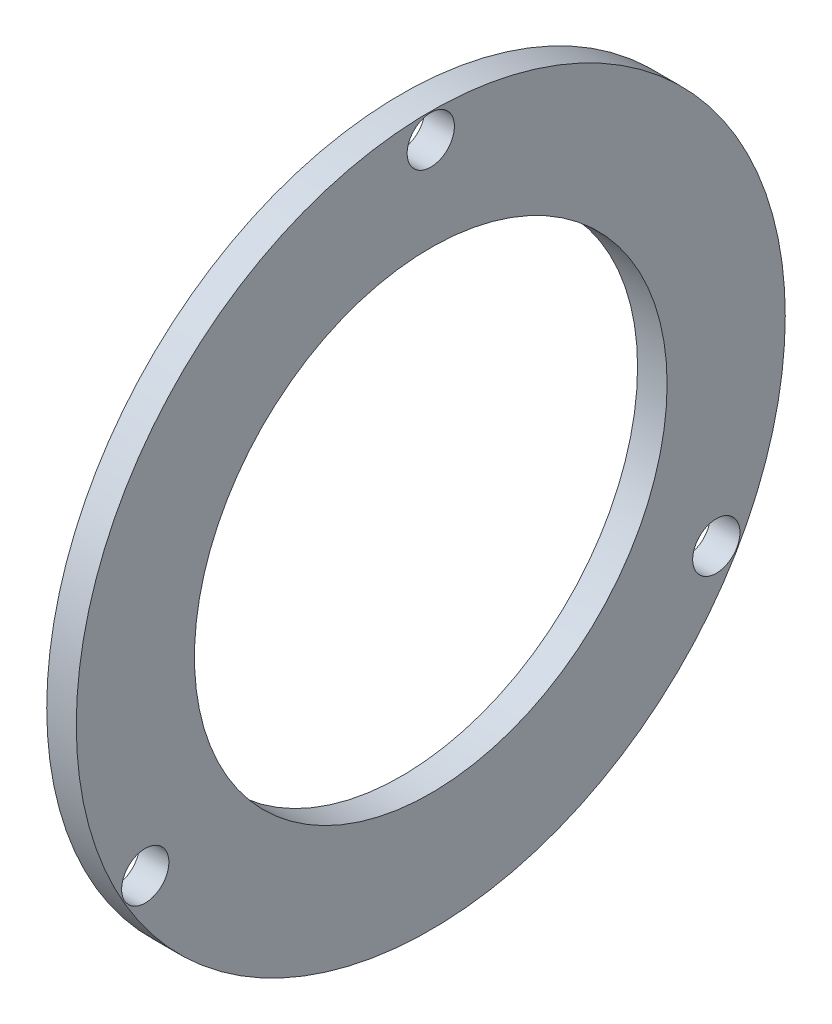
ISO-10303-21;
HEADER;
FILE_DESCRIPTION(('STEP AP214'),'2;1');
FILE_NAME('part.step','',(''),(''),'','','');
FILE_SCHEMA(('AUTOMOTIVE_DESIGN { 1 0 10303 214 1 1 1 1 }'));
ENDSEC;
DATA;
#1=APPLICATION_CONTEXT('core data for automotive mechanical design processes');
#2=APPLICATION_PROTOCOL_DEFINITION('international standard','automotive_design',2000,#1);
#3=PRODUCT_CONTEXT('',#1,'mechanical');
#4=PRODUCT('Part','Part','',(#3));
#5=PRODUCT_RELATED_PRODUCT_CATEGORY('part','',(#4));
#6=PRODUCT_DEFINITION_FORMATION('','',#4);
#7=PRODUCT_DEFINITION_CONTEXT('part definition',#1,'design');
#8=PRODUCT_DEFINITION('design','',#6,#7);
#9=PRODUCT_DEFINITION_SHAPE('','',#8);
#10=(LENGTH_UNIT() NAMED_UNIT(*) SI_UNIT(.MILLI.,.METRE.));
#11=(NAMED_UNIT(*) PLANE_ANGLE_UNIT() SI_UNIT($,.RADIAN.));
#12=(NAMED_UNIT(*) SI_UNIT($,.STERADIAN.) SOLID_ANGLE_UNIT());
#13=UNCERTAINTY_MEASURE_WITH_UNIT(LENGTH_MEASURE(1.E-05),#10,'distance_accuracy_value','');
#14=(GEOMETRIC_REPRESENTATION_CONTEXT(3) GLOBAL_UNCERTAINTY_ASSIGNED_CONTEXT((#13)) GLOBAL_UNIT_ASSIGNED_CONTEXT((#10,
#11,#12)) REPRESENTATION_CONTEXT('',''));
#15=CARTESIAN_POINT('',(0.,0.,0.));
#16=DIRECTION('',(0.,0.,1.));
#17=DIRECTION('',(1.,0.,0.));
#18=AXIS2_PLACEMENT_3D('',#15,#16,#17);
#19=CARTESIAN_POINT('',(6.35,0.,0.));
#20=DIRECTION('',(1.,0.,0.));
#21=DIRECTION('',(0.,0.,-1.));
#22=AXIS2_PLACEMENT_3D('',#19,#20,#21);
#23=PLANE('',#22);
#24=CARTESIAN_POINT('',(6.35,-35.4329999999975,-61.3717562645923));
#25=DIRECTION('',(1.,0.,0.));
#26=DIRECTION('',(0.,0.,-1.));
#27=AXIS2_PLACEMENT_3D('',#24,#25,#26);
#28=CIRCLE('',#27,5.08000000000277);
#29=CARTESIAN_POINT('',(6.35,-35.4329999999975,-66.4517562645951));
#30=VERTEX_POINT('',#29);
#31=EDGE_CURVE('E64',#30,#30,#28,.T.);
#32=ORIENTED_EDGE('',*,*,#31,.F.);
#33=EDGE_LOOP('',(#32));
#34=FACE_BOUND('',#33,.T.);
#35=CARTESIAN_POINT('',(6.35,0.,0.));
#36=DIRECTION('',(1.,0.,0.));
#37=DIRECTION('',(0.,0.,-1.));
#38=AXIS2_PLACEMENT_3D('',#35,#36,#37);
#39=CIRCLE('',#38,50.8);
#40=CARTESIAN_POINT('',(6.35,0.,-50.8));
#41=VERTEX_POINT('',#40);
#42=EDGE_CURVE('E50',#41,#41,#39,.T.);
#43=ORIENTED_EDGE('',*,*,#42,.F.);
#44=EDGE_LOOP('',(#43));
#45=FACE_BOUND('',#44,.T.);
#46=CARTESIAN_POINT('',(6.35,0.,0.));
#47=DIRECTION('',(1.,0.,0.));
#48=DIRECTION('',(0.,0.,-1.));
#49=AXIS2_PLACEMENT_3D('',#46,#47,#48);
#50=CIRCLE('',#49,76.2);
#51=CARTESIAN_POINT('',(6.35,0.,-76.2));
#52=VERTEX_POINT('',#51);
#53=EDGE_CURVE('E10',#52,#52,#50,.T.);
#54=ORIENTED_EDGE('',*,*,#53,.T.);
#55=EDGE_LOOP('',(#54));
#56=FACE_BOUND('',#55,.T.);
#57=CARTESIAN_POINT('',(6.35,70.866,0.));
#58=DIRECTION('',(1.,0.,0.));
#59=DIRECTION('',(0.,0.,-1.));
#60=AXIS2_PLACEMENT_3D('',#57,#58,#59);
#61=CIRCLE('',#60,5.08);
#62=CARTESIAN_POINT('',(6.35,70.866,-5.08));
#63=VERTEX_POINT('',#62);
#64=EDGE_CURVE('E56',#63,#63,#61,.T.);
#65=ORIENTED_EDGE('',*,*,#64,.F.);
#66=EDGE_LOOP('',(#65));
#67=FACE_BOUND('',#66,.T.);
#68=CARTESIAN_POINT('',(6.35,-35.4330000000025,61.3717562645838));
#69=DIRECTION('',(1.,0.,0.));
#70=DIRECTION('',(0.,0.,-1.));
#71=AXIS2_PLACEMENT_3D('',#68,#69,#70);
#72=CIRCLE('',#71,5.08000000000578);
#73=CARTESIAN_POINT('',(6.35,-35.4330000000025,56.291756264578));
#74=VERTEX_POINT('',#73);
#75=EDGE_CURVE('E72',#74,#74,#72,.T.);
#76=ORIENTED_EDGE('',*,*,#75,.F.);
#77=EDGE_LOOP('',(#76));
#78=FACE_BOUND('',#77,.T.);
#79=ADVANCED_FACE('F37',(#34,#45,#56,#67,#78),#23,.T.);
#80=CARTESIAN_POINT('',(0.,0.,0.));
#81=DIRECTION('',(1.,0.,0.));
#82=DIRECTION('',(0.,0.,-1.));
#83=AXIS2_PLACEMENT_3D('',#80,#81,#82);
#84=PLANE('',#83);
#85=CARTESIAN_POINT('',(0.,0.,0.));
#86=DIRECTION('',(1.,0.,0.));
#87=DIRECTION('',(0.,0.,-1.));
#88=AXIS2_PLACEMENT_3D('',#85,#86,#87);
#89=CIRCLE('',#88,76.2);
#90=CARTESIAN_POINT('',(0.,0.,-76.2));
#91=VERTEX_POINT('',#90);
#92=EDGE_CURVE('E41',#91,#91,#89,.T.);
#93=ORIENTED_EDGE('',*,*,#92,.F.);
#94=EDGE_LOOP('',(#93));
#95=FACE_BOUND('',#94,.T.);
#96=CARTESIAN_POINT('',(0.,0.,0.));
#97=DIRECTION('',(1.,0.,0.));
#98=DIRECTION('',(0.,0.,-1.));
#99=AXIS2_PLACEMENT_3D('',#96,#97,#98);
#100=CIRCLE('',#99,50.8);
#101=CARTESIAN_POINT('',(0.,0.,-50.8));
#102=VERTEX_POINT('',#101);
#103=EDGE_CURVE('E52',#102,#102,#100,.T.);
#104=ORIENTED_EDGE('',*,*,#103,.T.);
#105=EDGE_LOOP('',(#104));
#106=FACE_BOUND('',#105,.T.);
#107=CARTESIAN_POINT('',(0.,70.866,0.));
#108=DIRECTION('',(1.,0.,0.));
#109=DIRECTION('',(0.,0.,-1.));
#110=AXIS2_PLACEMENT_3D('',#107,#108,#109);
#111=CIRCLE('',#110,5.08);
#112=CARTESIAN_POINT('',(0.,70.866,-5.08));
#113=VERTEX_POINT('',#112);
#114=EDGE_CURVE('E60',#113,#113,#111,.T.);
#115=ORIENTED_EDGE('',*,*,#114,.T.);
#116=EDGE_LOOP('',(#115));
#117=FACE_BOUND('',#116,.T.);
#118=CARTESIAN_POINT('',(0.,-35.4329999999975,-61.3717562645923));
#119=DIRECTION('',(1.,0.,0.));
#120=DIRECTION('',(0.,0.,-1.));
#121=AXIS2_PLACEMENT_3D('',#118,#119,#120);
#122=CIRCLE('',#121,5.08000000000277);
#123=CARTESIAN_POINT('',(0.,-35.4329999999975,-66.4517562645951));
#124=VERTEX_POINT('',#123);
#125=EDGE_CURVE('E68',#124,#124,#122,.T.);
#126=ORIENTED_EDGE('',*,*,#125,.T.);
#127=EDGE_LOOP('',(#126));
#128=FACE_BOUND('',#127,.T.);
#129=CARTESIAN_POINT('',(0.,-35.4330000000025,61.3717562645838));
#130=DIRECTION('',(1.,0.,0.));
#131=DIRECTION('',(0.,0.,-1.));
#132=AXIS2_PLACEMENT_3D('',#129,#130,#131);
#133=CIRCLE('',#132,5.08000000000578);
#134=CARTESIAN_POINT('',(0.,-35.4330000000025,56.291756264578));
#135=VERTEX_POINT('',#134);
#136=EDGE_CURVE('E76',#135,#135,#133,.T.);
#137=ORIENTED_EDGE('',*,*,#136,.T.);
#138=EDGE_LOOP('',(#137));
#139=FACE_BOUND('',#138,.T.);
#140=ADVANCED_FACE('F88',(#95,#106,#117,#128,#139),#84,.F.);
#141=CARTESIAN_POINT('',(6.35,0.,0.));
#142=DIRECTION('',(-1.,0.,0.));
#143=DIRECTION('',(0.,0.,1.));
#144=AXIS2_PLACEMENT_3D('',#141,#142,#143);
#145=CYLINDRICAL_SURFACE('',#144,76.2);
#146=ORIENTED_EDGE('',*,*,#53,.F.);
#147=EDGE_LOOP('',(#146));
#148=FACE_BOUND('',#147,.T.);
#149=ORIENTED_EDGE('',*,*,#92,.T.);
#150=EDGE_LOOP('',(#149));
#151=FACE_BOUND('',#150,.T.);
#152=ADVANCED_FACE('F39',(#148,#151),#145,.T.);
#153=CARTESIAN_POINT('',(6.35,0.,0.));
#154=DIRECTION('',(-1.,0.,0.));
#155=DIRECTION('',(0.,0.,1.));
#156=AXIS2_PLACEMENT_3D('',#153,#154,#155);
#157=CYLINDRICAL_SURFACE('',#156,50.8);
#158=ORIENTED_EDGE('',*,*,#42,.T.);
#159=EDGE_LOOP('',(#158));
#160=FACE_BOUND('',#159,.T.);
#161=ORIENTED_EDGE('',*,*,#103,.F.);
#162=EDGE_LOOP('',(#161));
#163=FACE_BOUND('',#162,.T.);
#164=ADVANCED_FACE('F98',(#160,#163),#157,.F.);
#165=CARTESIAN_POINT('',(6.35,70.866,0.));
#166=DIRECTION('',(-1.,0.,0.));
#167=DIRECTION('',(0.,0.,1.));
#168=AXIS2_PLACEMENT_3D('',#165,#166,#167);
#169=CYLINDRICAL_SURFACE('',#168,5.08);
#170=ORIENTED_EDGE('',*,*,#64,.T.);
#171=EDGE_LOOP('',(#170));
#172=FACE_BOUND('',#171,.T.);
#173=ORIENTED_EDGE('',*,*,#114,.F.);
#174=EDGE_LOOP('',(#173));
#175=FACE_BOUND('',#174,.T.);
#176=ADVANCED_FACE('F101',(#172,#175),#169,.F.);
#177=CARTESIAN_POINT('',(6.35,-35.4329999999975,-61.3717562645923));
#178=DIRECTION('',(-1.,0.,0.));
#179=DIRECTION('',(0.,0.,1.));
#180=AXIS2_PLACEMENT_3D('',#177,#178,#179);
#181=CYLINDRICAL_SURFACE('',#180,5.08000000000277);
#182=ORIENTED_EDGE('',*,*,#31,.T.);
#183=EDGE_LOOP('',(#182));
#184=FACE_BOUND('',#183,.T.);
#185=ORIENTED_EDGE('',*,*,#125,.F.);
#186=EDGE_LOOP('',(#185));
#187=FACE_BOUND('',#186,.T.);
#188=ADVANCED_FACE('F105',(#184,#187),#181,.F.);
#189=CARTESIAN_POINT('',(6.35,-35.4330000000025,61.3717562645838));
#190=DIRECTION('',(-1.,0.,0.));
#191=DIRECTION('',(0.,0.,1.));
#192=AXIS2_PLACEMENT_3D('',#189,#190,#191);
#193=CYLINDRICAL_SURFACE('',#192,5.08000000000578);
#194=ORIENTED_EDGE('',*,*,#75,.T.);
#195=EDGE_LOOP('',(#194));
#196=FACE_BOUND('',#195,.T.);
#197=ORIENTED_EDGE('',*,*,#136,.F.);
#198=EDGE_LOOP('',(#197));
#199=FACE_BOUND('',#198,.T.);
#200=ADVANCED_FACE('F84',(#196,#199),#193,.F.);
#201=CLOSED_SHELL('',(#79,#140,#152,#164,#176,#188,#200));
#202=MANIFOLD_SOLID_BREP('B2',#201);
#203=ADVANCED_BREP_SHAPE_REPRESENTATION('',(#18,#202),#14);
#204=SHAPE_DEFINITION_REPRESENTATION(#9,#203);
ENDSEC;
END-ISO-10303-21;
